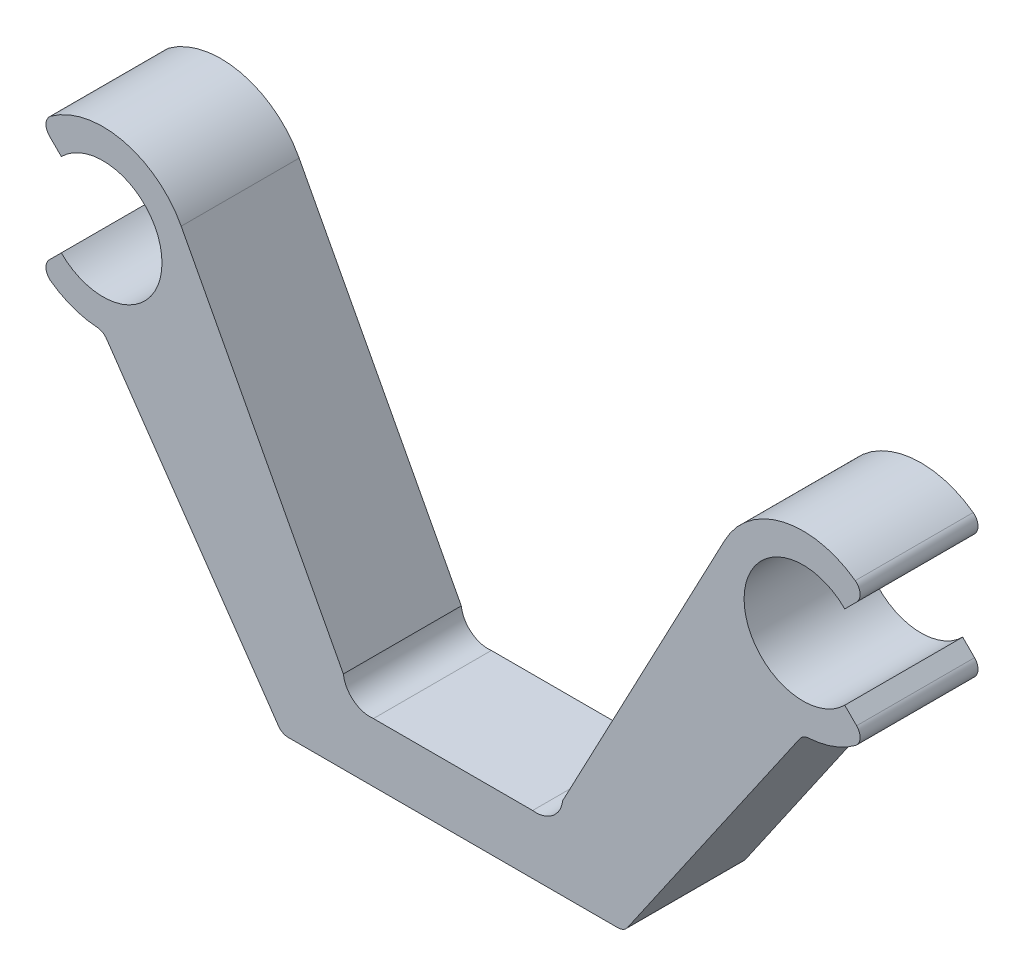
ISO-10303-21;
HEADER;
FILE_DESCRIPTION(('STEP AP214'),'2;1');
FILE_NAME('part.step','',(''),(''),'','','');
FILE_SCHEMA(('AUTOMOTIVE_DESIGN { 1 0 10303 214 1 1 1 1 }'));
ENDSEC;
DATA;
#1=APPLICATION_CONTEXT('core data for automotive mechanical design processes');
#2=APPLICATION_PROTOCOL_DEFINITION('international standard','automotive_design',2000,#1);
#3=PRODUCT_CONTEXT('',#1,'mechanical');
#4=PRODUCT('Part','Part','',(#3));
#5=PRODUCT_RELATED_PRODUCT_CATEGORY('part','',(#4));
#6=PRODUCT_DEFINITION_FORMATION('','',#4);
#7=PRODUCT_DEFINITION_CONTEXT('part definition',#1,'design');
#8=PRODUCT_DEFINITION('design','',#6,#7);
#9=PRODUCT_DEFINITION_SHAPE('','',#8);
#10=(LENGTH_UNIT() NAMED_UNIT(*) SI_UNIT(.MILLI.,.METRE.));
#11=(NAMED_UNIT(*) PLANE_ANGLE_UNIT() SI_UNIT($,.RADIAN.));
#12=(NAMED_UNIT(*) SI_UNIT($,.STERADIAN.) SOLID_ANGLE_UNIT());
#13=UNCERTAINTY_MEASURE_WITH_UNIT(LENGTH_MEASURE(1.E-05),#10,'distance_accuracy_value','');
#14=(GEOMETRIC_REPRESENTATION_CONTEXT(3) GLOBAL_UNCERTAINTY_ASSIGNED_CONTEXT((#13)) GLOBAL_UNIT_ASSIGNED_CONTEXT((#10,
#11,#12)) REPRESENTATION_CONTEXT('',''));
#15=CARTESIAN_POINT('',(0.,0.,0.));
#16=DIRECTION('',(0.,0.,1.));
#17=DIRECTION('',(1.,0.,0.));
#18=AXIS2_PLACEMENT_3D('',#15,#16,#17);
#19=CARTESIAN_POINT('',(-14.5,0.,10.));
#20=DIRECTION('',(0.823080115562498,0.567925279738123,0.));
#21=DIRECTION('',(-0.567925279738123,0.823080115562498,0.));
#22=AXIS2_PLACEMENT_3D('',#19,#20,#21);
#23=PLANE('',#22);
#24=DIRECTION('',(0.567925279738123,-0.823080115562497,0.));
#25=VECTOR('',#24,1.);
#26=CARTESIAN_POINT('',(-14.5,0.,10.));
#27=LINE('',#26,#25);
#28=CARTESIAN_POINT('',(-29.3935692224924,21.5848829311485,10.));
#29=VERTEX_POINT('',#28);
#30=CARTESIAN_POINT('',(-14.7981315569807,0.432074720261878,10.));
#31=VERTEX_POINT('',#30);
#32=EDGE_CURVE('E282',#29,#31,#27,.T.);
#33=ORIENTED_EDGE('',*,*,#32,.F.);
#34=DIRECTION('',(0.,0.,1.));
#35=VECTOR('',#34,1.);
#36=CARTESIAN_POINT('',(-29.3935692224924,21.5848829311485,0.));
#37=LINE('',#36,#35);
#38=CARTESIAN_POINT('',(-29.3935692224924,21.5848829311485,0.));
#39=VERTEX_POINT('',#38);
#40=EDGE_CURVE('E341',#29,#39,#37,.F.);
#41=ORIENTED_EDGE('',*,*,#40,.T.);
#42=DIRECTION('',(0.567925279738123,-0.823080115562497,0.));
#43=VECTOR('',#42,1.);
#44=CARTESIAN_POINT('',(-14.5,0.,0.));
#45=LINE('',#44,#43);
#46=CARTESIAN_POINT('',(-14.7981315569807,0.432074720261878,0.));
#47=VERTEX_POINT('',#46);
#48=EDGE_CURVE('E472',#39,#47,#45,.T.);
#49=ORIENTED_EDGE('',*,*,#48,.T.);
#50=DIRECTION('',(0.,0.,-1.));
#51=VECTOR('',#50,1.);
#52=CARTESIAN_POINT('',(-14.7981315569807,0.432074720261878,10.));
#53=LINE('',#52,#51);
#54=EDGE_CURVE('E338',#47,#31,#53,.F.);
#55=ORIENTED_EDGE('',*,*,#54,.T.);
#56=EDGE_LOOP('',(#33,#41,#49,#55));
#57=FACE_BOUND('',#56,.T.);
#58=ADVANCED_FACE('F38',(#57),#23,.F.);
#59=CARTESIAN_POINT('',(14.5,0.,10.));
#60=DIRECTION('',(0.,1.,0.));
#61=DIRECTION('',(0.,0.,1.));
#62=AXIS2_PLACEMENT_3D('',#59,#60,#61);
#63=PLANE('',#62);
#64=CARTESIAN_POINT('',(-11.75,0.,5.));
#65=DIRECTION('',(0.,-1.,0.));
#66=DIRECTION('',(0.,0.,-1.));
#67=AXIS2_PLACEMENT_3D('',#64,#65,#66);
#68=CIRCLE('',#67,1.35);
#69=CARTESIAN_POINT('',(-11.75,0.,3.65));
#70=VERTEX_POINT('',#69);
#71=EDGE_CURVE('E490',#70,#70,#68,.T.);
#72=ORIENTED_EDGE('',*,*,#71,.F.);
#73=EDGE_LOOP('',(#72));
#74=FACE_BOUND('',#73,.T.);
#75=CARTESIAN_POINT('',(11.75,0.,5.));
#76=DIRECTION('',(0.,-1.,0.));
#77=DIRECTION('',(0.,0.,-1.));
#78=AXIS2_PLACEMENT_3D('',#75,#76,#77);
#79=CIRCLE('',#78,1.35);
#80=CARTESIAN_POINT('',(11.75,0.,3.65));
#81=VERTEX_POINT('',#80);
#82=EDGE_CURVE('E548',#81,#81,#79,.T.);
#83=ORIENTED_EDGE('',*,*,#82,.F.);
#84=EDGE_LOOP('',(#83));
#85=FACE_BOUND('',#84,.T.);
#86=DIRECTION('',(1.,0.,0.));
#87=VECTOR('',#86,1.);
#88=CARTESIAN_POINT('',(14.5,0.,0.));
#89=LINE('',#88,#87);
#90=CARTESIAN_POINT('',(-13.9750514414182,0.,0.));
#91=VERTEX_POINT('',#90);
#92=CARTESIAN_POINT('',(13.9750514414182,0.,0.));
#93=VERTEX_POINT('',#92);
#94=EDGE_CURVE('E420',#91,#93,#89,.T.);
#95=ORIENTED_EDGE('',*,*,#94,.T.);
#96=DIRECTION('',(0.,0.,-1.));
#97=VECTOR('',#96,1.);
#98=CARTESIAN_POINT('',(13.9750514414182,0.,10.));
#99=LINE('',#98,#97);
#100=CARTESIAN_POINT('',(13.9750514414182,0.,10.));
#101=VERTEX_POINT('',#100);
#102=EDGE_CURVE('E398',#93,#101,#99,.F.);
#103=ORIENTED_EDGE('',*,*,#102,.T.);
#104=DIRECTION('',(1.,0.,0.));
#105=VECTOR('',#104,1.);
#106=CARTESIAN_POINT('',(14.5,0.,10.));
#107=LINE('',#106,#105);
#108=CARTESIAN_POINT('',(-13.9750514414182,0.,10.));
#109=VERTEX_POINT('',#108);
#110=EDGE_CURVE('E434',#109,#101,#107,.T.);
#111=ORIENTED_EDGE('',*,*,#110,.F.);
#112=DIRECTION('',(0.,0.,-1.));
#113=VECTOR('',#112,1.);
#114=CARTESIAN_POINT('',(-13.9750514414182,0.,10.));
#115=LINE('',#114,#113);
#116=EDGE_CURVE('E394',#109,#91,#115,.T.);
#117=ORIENTED_EDGE('',*,*,#116,.T.);
#118=EDGE_LOOP('',(#95,#103,#111,#117));
#119=FACE_BOUND('',#118,.T.);
#120=ADVANCED_FACE('F516',(#74,#85,#119),#63,.F.);
#121=CARTESIAN_POINT('',(14.5,0.,10.));
#122=DIRECTION('',(-0.823080115562498,0.567925279738123,0.));
#123=DIRECTION('',(-0.567925279738123,-0.823080115562498,0.));
#124=AXIS2_PLACEMENT_3D('',#121,#122,#123);
#125=PLANE('',#124);
#126=DIRECTION('',(0.567925279738123,0.823080115562497,0.));
#127=VECTOR('',#126,1.);
#128=CARTESIAN_POINT('',(14.5,0.,0.));
#129=LINE('',#128,#127);
#130=CARTESIAN_POINT('',(14.7981315569807,0.432074720261876,0.));
#131=VERTEX_POINT('',#130);
#132=CARTESIAN_POINT('',(29.3935692224924,21.5848829311485,0.));
#133=VERTEX_POINT('',#132);
#134=EDGE_CURVE('E410',#131,#133,#129,.T.);
#135=ORIENTED_EDGE('',*,*,#134,.T.);
#136=DIRECTION('',(0.,0.,1.));
#137=VECTOR('',#136,1.);
#138=CARTESIAN_POINT('',(29.3935692224924,21.5848829311485,10.));
#139=LINE('',#138,#137);
#140=CARTESIAN_POINT('',(29.3935692224924,21.5848829311485,10.));
#141=VERTEX_POINT('',#140);
#142=EDGE_CURVE('E387',#133,#141,#139,.T.);
#143=ORIENTED_EDGE('',*,*,#142,.T.);
#144=DIRECTION('',(0.567925279738123,0.823080115562497,0.));
#145=VECTOR('',#144,1.);
#146=CARTESIAN_POINT('',(14.5,0.,10.));
#147=LINE('',#146,#145);
#148=CARTESIAN_POINT('',(14.7981315569807,0.432074720261876,10.));
#149=VERTEX_POINT('',#148);
#150=EDGE_CURVE('E426',#149,#141,#147,.T.);
#151=ORIENTED_EDGE('',*,*,#150,.F.);
#152=DIRECTION('',(0.,0.,-1.));
#153=VECTOR('',#152,1.);
#154=CARTESIAN_POINT('',(14.7981315569807,0.432074720261876,10.));
#155=LINE('',#154,#153);
#156=EDGE_CURVE('E383',#149,#131,#155,.T.);
#157=ORIENTED_EDGE('',*,*,#156,.T.);
#158=EDGE_LOOP('',(#135,#143,#151,#157));
#159=FACE_BOUND('',#158,.T.);
#160=ADVANCED_FACE('F415',(#159),#125,.F.);
#161=CARTESIAN_POINT('',(29.68,29.5,10.));
#162=DIRECTION('',(0.,0.,-1.));
#163=DIRECTION('',(-1.,0.,0.));
#164=AXIS2_PLACEMENT_3D('',#161,#162,#163);
#165=CYLINDRICAL_SURFACE('',#164,7.5);
#166=CARTESIAN_POINT('',(29.68,29.5,10.));
#167=DIRECTION('',(0.,0.,1.));
#168=DIRECTION('',(-1.,0.,0.));
#169=AXIS2_PLACEMENT_3D('',#166,#167,#168);
#170=CIRCLE('',#169,7.5);
#171=CARTESIAN_POINT('',(30.1535141218132,22.0149626335974,10.));
#172=VERTEX_POINT('',#171);
#173=CARTESIAN_POINT('',(34.1042716345688,23.4439434857698,10.));
#174=VERTEX_POINT('',#173);
#175=EDGE_CURVE('E425',#172,#174,#170,.T.);
#176=ORIENTED_EDGE('',*,*,#175,.F.);
#177=DIRECTION('',(0.,0.,-1.));
#178=VECTOR('',#177,1.);
#179=CARTESIAN_POINT('',(30.1535141218132,22.0149626335974,10.));
#180=LINE('',#179,#178);
#181=CARTESIAN_POINT('',(30.1535141218132,22.0149626335974,0.));
#182=VERTEX_POINT('',#181);
#183=EDGE_CURVE('E379',#172,#182,#180,.T.);
#184=ORIENTED_EDGE('',*,*,#183,.T.);
#185=CARTESIAN_POINT('',(29.68,29.5,0.));
#186=DIRECTION('',(0.,0.,1.));
#187=DIRECTION('',(-1.,0.,0.));
#188=AXIS2_PLACEMENT_3D('',#185,#186,#187);
#189=CIRCLE('',#188,7.5);
#190=CARTESIAN_POINT('',(34.1042716345688,23.4439434857698,0.));
#191=VERTEX_POINT('',#190);
#192=EDGE_CURVE('E249',#182,#191,#189,.T.);
#193=ORIENTED_EDGE('',*,*,#192,.T.);
#194=DIRECTION('',(0.,0.,-1.));
#195=VECTOR('',#194,1.);
#196=CARTESIAN_POINT('',(34.1042716345688,23.4439434857698,10.));
#197=LINE('',#196,#195);
#198=EDGE_CURVE('E62',#191,#174,#197,.F.);
#199=ORIENTED_EDGE('',*,*,#198,.T.);
#200=EDGE_LOOP('',(#176,#184,#193,#199));
#201=FACE_BOUND('',#200,.T.);
#202=ADVANCED_FACE('F427',(#201),#165,.T.);
#203=CARTESIAN_POINT('',(29.68,29.5,10.));
#204=DIRECTION('',(-0.707106781186554,-0.707106781186541,0.));
#205=DIRECTION('',(0.707106781186541,-0.707106781186554,0.));
#206=AXIS2_PLACEMENT_3D('',#203,#204,#205);
#207=PLANE('',#206);
#208=DIRECTION('',(-0.707106781186541,0.707106781186554,0.));
#209=VECTOR('',#208,1.);
#210=CARTESIAN_POINT('',(29.68,29.5,10.));
#211=LINE('',#210,#209);
#212=CARTESIAN_POINT('',(34.2214755311462,24.9585244688537,10.));
#213=VERTEX_POINT('',#212);
#214=CARTESIAN_POINT('',(33.2155339059327,25.9644660940672,10.));
#215=VERTEX_POINT('',#214);
#216=EDGE_CURVE('E429',#213,#215,#211,.T.);
#217=ORIENTED_EDGE('',*,*,#216,.F.);
#218=DIRECTION('',(0.,0.,-1.));
#219=VECTOR('',#218,1.);
#220=CARTESIAN_POINT('',(34.2214755311462,24.9585244688537,10.));
#221=LINE('',#220,#219);
#222=CARTESIAN_POINT('',(34.2214755311462,24.9585244688537,0.));
#223=VERTEX_POINT('',#222);
#224=EDGE_CURVE('E390',#213,#223,#221,.T.);
#225=ORIENTED_EDGE('',*,*,#224,.T.);
#226=DIRECTION('',(-0.707106781186541,0.707106781186554,0.));
#227=VECTOR('',#226,1.);
#228=CARTESIAN_POINT('',(29.68,29.5,0.));
#229=LINE('',#228,#227);
#230=CARTESIAN_POINT('',(33.2155339059327,25.9644660940672,0.));
#231=VERTEX_POINT('',#230);
#232=EDGE_CURVE('E243',#223,#231,#229,.T.);
#233=ORIENTED_EDGE('',*,*,#232,.T.);
#234=DIRECTION('',(0.,0.,1.));
#235=VECTOR('',#234,1.);
#236=CARTESIAN_POINT('',(33.2155339059327,25.9644660940672,0.));
#237=LINE('',#236,#235);
#238=EDGE_CURVE('E220',#231,#215,#237,.T.);
#239=ORIENTED_EDGE('',*,*,#238,.T.);
#240=EDGE_LOOP('',(#217,#225,#233,#239));
#241=FACE_BOUND('',#240,.T.);
#242=ADVANCED_FACE('F484',(#241),#207,.F.);
#243=CARTESIAN_POINT('',(29.68,29.5,10.));
#244=DIRECTION('',(-0.707106781186544,0.707106781186551,0.));
#245=DIRECTION('',(-0.707106781186551,-0.707106781186544,0.));
#246=AXIS2_PLACEMENT_3D('',#243,#244,#245);
#247=PLANE('',#246);
#248=DIRECTION('',(0.707106781186551,0.707106781186544,0.));
#249=VECTOR('',#248,1.);
#250=CARTESIAN_POINT('',(29.68,29.5,0.));
#251=LINE('',#250,#249);
#252=CARTESIAN_POINT('',(33.2155339059328,33.0355339059327,0.));
#253=VERTEX_POINT('',#252);
#254=CARTESIAN_POINT('',(34.2214755311463,34.0414755311462,0.));
#255=VERTEX_POINT('',#254);
#256=EDGE_CURVE('E232',#253,#255,#251,.T.);
#257=ORIENTED_EDGE('',*,*,#256,.T.);
#258=DIRECTION('',(0.,0.,-1.));
#259=VECTOR('',#258,1.);
#260=CARTESIAN_POINT('',(34.2214755311463,34.0414755311462,10.));
#261=LINE('',#260,#259);
#262=CARTESIAN_POINT('',(34.2214755311463,34.0414755311462,10.));
#263=VERTEX_POINT('',#262);
#264=EDGE_CURVE('E363',#255,#263,#261,.F.);
#265=ORIENTED_EDGE('',*,*,#264,.T.);
#266=DIRECTION('',(0.707106781186551,0.707106781186544,0.));
#267=VECTOR('',#266,1.);
#268=CARTESIAN_POINT('',(29.68,29.5,10.));
#269=LINE('',#268,#267);
#270=CARTESIAN_POINT('',(33.2155339059328,33.0355339059327,10.));
#271=VERTEX_POINT('',#270);
#272=EDGE_CURVE('E235',#271,#263,#269,.T.);
#273=ORIENTED_EDGE('',*,*,#272,.F.);
#274=DIRECTION('',(0.,0.,1.));
#275=VECTOR('',#274,1.);
#276=CARTESIAN_POINT('',(33.2155339059328,33.0355339059327,0.));
#277=LINE('',#276,#275);
#278=EDGE_CURVE('E217',#271,#253,#277,.F.);
#279=ORIENTED_EDGE('',*,*,#278,.T.);
#280=EDGE_LOOP('',(#257,#265,#273,#279));
#281=FACE_BOUND('',#280,.T.);
#282=ADVANCED_FACE('F231',(#281),#247,.F.);
#283=CARTESIAN_POINT('',(29.68,29.5,10.));
#284=DIRECTION('',(0.,0.,-1.));
#285=DIRECTION('',(-1.,0.,0.));
#286=AXIS2_PLACEMENT_3D('',#283,#284,#285);
#287=CYLINDRICAL_SURFACE('',#286,7.5);
#288=CARTESIAN_POINT('',(29.68,29.5,10.));
#289=DIRECTION('',(0.,0.,1.));
#290=DIRECTION('',(-1.,0.,0.));
#291=AXIS2_PLACEMENT_3D('',#288,#289,#290);
#292=CIRCLE('',#291,7.5);
#293=CARTESIAN_POINT('',(34.1042716345689,35.5560565142301,10.));
#294=VERTEX_POINT('',#293);
#295=CARTESIAN_POINT('',(23.0497519628966,33.0056826676821,10.));
#296=VERTEX_POINT('',#295);
#297=EDGE_CURVE('E440',#294,#296,#292,.T.);
#298=ORIENTED_EDGE('',*,*,#297,.F.);
#299=DIRECTION('',(0.,0.,-1.));
#300=VECTOR('',#299,1.);
#301=CARTESIAN_POINT('',(34.1042716345689,35.5560565142301,10.));
#302=LINE('',#301,#300);
#303=CARTESIAN_POINT('',(34.1042716345689,35.5560565142301,0.));
#304=VERTEX_POINT('',#303);
#305=EDGE_CURVE('E348',#294,#304,#302,.T.);
#306=ORIENTED_EDGE('',*,*,#305,.T.);
#307=CARTESIAN_POINT('',(29.68,29.5,0.));
#308=DIRECTION('',(0.,0.,1.));
#309=DIRECTION('',(-1.,0.,0.));
#310=AXIS2_PLACEMENT_3D('',#307,#308,#309);
#311=CIRCLE('',#310,7.5);
#312=CARTESIAN_POINT('',(23.0497519628966,33.0056826676821,0.));
#313=VERTEX_POINT('',#312);
#314=EDGE_CURVE('E242',#304,#313,#311,.T.);
#315=ORIENTED_EDGE('',*,*,#314,.T.);
#316=DIRECTION('',(0.,0.,-1.));
#317=VECTOR('',#316,1.);
#318=CARTESIAN_POINT('',(23.0497519628966,33.0056826676821,10.));
#319=LINE('',#318,#317);
#320=EDGE_CURVE('E304',#296,#313,#319,.T.);
#321=ORIENTED_EDGE('',*,*,#320,.F.);
#322=EDGE_LOOP('',(#298,#306,#315,#321));
#323=FACE_BOUND('',#322,.T.);
#324=ADVANCED_FACE('F663',(#323),#287,.T.);
#325=CARTESIAN_POINT('',(9.29948644052819,7.,10.));
#326=DIRECTION('',(0.884033071613786,-0.467424355690945,0.));
#327=DIRECTION('',(0.467424355690945,0.884033071613786,0.));
#328=AXIS2_PLACEMENT_3D('',#325,#326,#327);
#329=PLANE('',#328);
#330=DIRECTION('',(-0.467424355690945,-0.884033071613786,0.));
#331=VECTOR('',#330,1.);
#332=CARTESIAN_POINT('',(9.29948644052819,7.,0.));
#333=LINE('',#332,#331);
#334=CARTESIAN_POINT('',(9.29948644052819,7.,0.));
#335=VERTEX_POINT('',#334);
#336=EDGE_CURVE('E247',#313,#335,#333,.T.);
#337=ORIENTED_EDGE('',*,*,#336,.T.);
#338=DIRECTION('',(0.,0.,-1.));
#339=VECTOR('',#338,1.);
#340=CARTESIAN_POINT('',(9.29948644052819,7.,10.));
#341=LINE('',#340,#339);
#342=CARTESIAN_POINT('',(9.29948644052819,7.,10.));
#343=VERTEX_POINT('',#342);
#344=EDGE_CURVE('E300',#343,#335,#341,.T.);
#345=ORIENTED_EDGE('',*,*,#344,.F.);
#346=DIRECTION('',(-0.467424355690945,-0.884033071613786,0.));
#347=VECTOR('',#346,1.);
#348=CARTESIAN_POINT('',(9.29948644052819,7.,10.));
#349=LINE('',#348,#347);
#350=EDGE_CURVE('E443',#296,#343,#349,.T.);
#351=ORIENTED_EDGE('',*,*,#350,.F.);
#352=ORIENTED_EDGE('',*,*,#320,.T.);
#353=EDGE_LOOP('',(#337,#345,#351,#352));
#354=FACE_BOUND('',#353,.T.);
#355=ADVANCED_FACE('F667',(#354),#329,.F.);
#356=CARTESIAN_POINT('',(7.02474322026409,7.2747432202641,10.));
#357=DIRECTION('',(0.,0.,-1.));
#358=DIRECTION('',(-1.,0.,0.));
#359=AXIS2_PLACEMENT_3D('',#356,#357,#358);
#360=CYLINDRICAL_SURFACE('',#359,2.29127487552641);
#361=CARTESIAN_POINT('',(7.02474322026409,7.2747432202641,0.));
#362=DIRECTION('',(0.,0.,-1.));
#363=DIRECTION('',(1.,0.,0.));
#364=AXIS2_PLACEMENT_3D('',#361,#362,#363);
#365=CIRCLE('',#364,2.29127487552641);
#366=CARTESIAN_POINT('',(6.75,5.,0.));
#367=VERTEX_POINT('',#366);
#368=EDGE_CURVE('E255',#335,#367,#365,.T.);
#369=ORIENTED_EDGE('',*,*,#368,.T.);
#370=DIRECTION('',(0.,0.,-1.));
#371=VECTOR('',#370,1.);
#372=CARTESIAN_POINT('',(6.75,5.,10.));
#373=LINE('',#372,#371);
#374=CARTESIAN_POINT('',(6.75,5.,10.));
#375=VERTEX_POINT('',#374);
#376=EDGE_CURVE('E296',#375,#367,#373,.T.);
#377=ORIENTED_EDGE('',*,*,#376,.F.);
#378=CARTESIAN_POINT('',(7.02474322026409,7.2747432202641,10.));
#379=DIRECTION('',(0.,0.,-1.));
#380=DIRECTION('',(1.,0.,0.));
#381=AXIS2_PLACEMENT_3D('',#378,#379,#380);
#382=CIRCLE('',#381,2.29127487552641);
#383=EDGE_CURVE('E446',#343,#375,#382,.T.);
#384=ORIENTED_EDGE('',*,*,#383,.F.);
#385=ORIENTED_EDGE('',*,*,#344,.T.);
#386=EDGE_LOOP('',(#369,#377,#384,#385));
#387=FACE_BOUND('',#386,.T.);
#388=ADVANCED_FACE('F720',(#387),#360,.F.);
#389=CARTESIAN_POINT('',(6.75,5.,10.));
#390=DIRECTION('',(0.,-1.,0.));
#391=DIRECTION('',(0.,0.,-1.));
#392=AXIS2_PLACEMENT_3D('',#389,#390,#391);
#393=PLANE('',#392);
#394=DIRECTION('',(-1.,0.,0.));
#395=VECTOR('',#394,1.);
#396=CARTESIAN_POINT('',(6.75,5.,0.));
#397=LINE('',#396,#395);
#398=CARTESIAN_POINT('',(-6.75,5.,0.));
#399=VERTEX_POINT('',#398);
#400=EDGE_CURVE('E258',#367,#399,#397,.T.);
#401=ORIENTED_EDGE('',*,*,#400,.T.);
#402=DIRECTION('',(0.,0.,-1.));
#403=VECTOR('',#402,1.);
#404=CARTESIAN_POINT('',(-6.75,5.,10.));
#405=LINE('',#404,#403);
#406=CARTESIAN_POINT('',(-6.75,5.,10.));
#407=VERTEX_POINT('',#406);
#408=EDGE_CURVE('E292',#407,#399,#405,.T.);
#409=ORIENTED_EDGE('',*,*,#408,.F.);
#410=DIRECTION('',(-1.,0.,0.));
#411=VECTOR('',#410,1.);
#412=CARTESIAN_POINT('',(6.75,5.,10.));
#413=LINE('',#412,#411);
#414=EDGE_CURVE('E449',#375,#407,#413,.T.);
#415=ORIENTED_EDGE('',*,*,#414,.F.);
#416=ORIENTED_EDGE('',*,*,#376,.T.);
#417=EDGE_LOOP('',(#401,#409,#415,#416));
#418=FACE_BOUND('',#417,.T.);
#419=ADVANCED_FACE('F729',(#418),#393,.F.);
#420=CARTESIAN_POINT('',(-7.02474322026409,7.2747432202641,10.));
#421=DIRECTION('',(0.,0.,-1.));
#422=DIRECTION('',(-1.,0.,0.));
#423=AXIS2_PLACEMENT_3D('',#420,#421,#422);
#424=CYLINDRICAL_SURFACE('',#423,2.29127487552641);
#425=CARTESIAN_POINT('',(-7.02474322026409,7.2747432202641,0.));
#426=DIRECTION('',(0.,0.,-1.));
#427=DIRECTION('',(-1.,0.,0.));
#428=AXIS2_PLACEMENT_3D('',#425,#426,#427);
#429=CIRCLE('',#428,2.29127487552641);
#430=CARTESIAN_POINT('',(-9.29948644052819,7.,0.));
#431=VERTEX_POINT('',#430);
#432=EDGE_CURVE('E261',#399,#431,#429,.T.);
#433=ORIENTED_EDGE('',*,*,#432,.T.);
#434=DIRECTION('',(0.,0.,-1.));
#435=VECTOR('',#434,1.);
#436=CARTESIAN_POINT('',(-9.29948644052819,7.,10.));
#437=LINE('',#436,#435);
#438=CARTESIAN_POINT('',(-9.29948644052819,7.,10.));
#439=VERTEX_POINT('',#438);
#440=EDGE_CURVE('E287',#439,#431,#437,.T.);
#441=ORIENTED_EDGE('',*,*,#440,.F.);
#442=CARTESIAN_POINT('',(-7.02474322026409,7.2747432202641,10.));
#443=DIRECTION('',(0.,0.,-1.));
#444=DIRECTION('',(-1.,0.,0.));
#445=AXIS2_PLACEMENT_3D('',#442,#443,#444);
#446=CIRCLE('',#445,2.29127487552641);
#447=EDGE_CURVE('E452',#407,#439,#446,.T.);
#448=ORIENTED_EDGE('',*,*,#447,.F.);
#449=ORIENTED_EDGE('',*,*,#408,.T.);
#450=EDGE_LOOP('',(#433,#441,#448,#449));
#451=FACE_BOUND('',#450,.T.);
#452=ADVANCED_FACE('F738',(#451),#424,.F.);
#453=CARTESIAN_POINT('',(-9.29948644052819,7.,10.));
#454=DIRECTION('',(-0.884033071613786,-0.467424355690945,0.));
#455=DIRECTION('',(0.467424355690945,-0.884033071613786,0.));
#456=AXIS2_PLACEMENT_3D('',#453,#454,#455);
#457=PLANE('',#456);
#458=DIRECTION('',(-0.467424355690945,0.884033071613786,0.));
#459=VECTOR('',#458,1.);
#460=CARTESIAN_POINT('',(-9.29948644052819,7.,0.));
#461=LINE('',#460,#459);
#462=CARTESIAN_POINT('',(-23.0497519628966,33.0056826676821,0.));
#463=VERTEX_POINT('',#462);
#464=EDGE_CURVE('E264',#431,#463,#461,.T.);
#465=ORIENTED_EDGE('',*,*,#464,.T.);
#466=DIRECTION('',(0.,0.,-1.));
#467=VECTOR('',#466,1.);
#468=CARTESIAN_POINT('',(-23.0497519628966,33.0056826676821,10.));
#469=LINE('',#468,#467);
#470=CARTESIAN_POINT('',(-23.0497519628966,33.0056826676821,10.));
#471=VERTEX_POINT('',#470);
#472=EDGE_CURVE('E283',#471,#463,#469,.T.);
#473=ORIENTED_EDGE('',*,*,#472,.F.);
#474=DIRECTION('',(-0.467424355690945,0.884033071613786,0.));
#475=VECTOR('',#474,1.);
#476=CARTESIAN_POINT('',(-9.29948644052819,7.,10.));
#477=LINE('',#476,#475);
#478=EDGE_CURVE('E455',#439,#471,#477,.T.);
#479=ORIENTED_EDGE('',*,*,#478,.F.);
#480=ORIENTED_EDGE('',*,*,#440,.T.);
#481=EDGE_LOOP('',(#465,#473,#479,#480));
#482=FACE_BOUND('',#481,.T.);
#483=ADVANCED_FACE('F747',(#482),#457,.F.);
#484=CARTESIAN_POINT('',(-29.68,29.5,10.));
#485=DIRECTION('',(0.,0.,-1.));
#486=DIRECTION('',(-1.,0.,0.));
#487=AXIS2_PLACEMENT_3D('',#484,#485,#486);
#488=CYLINDRICAL_SURFACE('',#487,7.5);
#489=CARTESIAN_POINT('',(-29.68,29.5,0.));
#490=DIRECTION('',(0.,0.,1.));
#491=DIRECTION('',(1.,0.,0.));
#492=AXIS2_PLACEMENT_3D('',#489,#490,#491);
#493=CIRCLE('',#492,7.5);
#494=CARTESIAN_POINT('',(-34.1042716345689,35.5560565142301,0.));
#495=VERTEX_POINT('',#494);
#496=EDGE_CURVE('E267',#463,#495,#493,.T.);
#497=ORIENTED_EDGE('',*,*,#496,.T.);
#498=DIRECTION('',(0.,0.,-1.));
#499=VECTOR('',#498,1.);
#500=CARTESIAN_POINT('',(-34.1042716345689,35.5560565142301,10.));
#501=LINE('',#500,#499);
#502=CARTESIAN_POINT('',(-34.1042716345689,35.5560565142301,10.));
#503=VERTEX_POINT('',#502);
#504=EDGE_CURVE('E335',#495,#503,#501,.F.);
#505=ORIENTED_EDGE('',*,*,#504,.T.);
#506=CARTESIAN_POINT('',(-29.68,29.5,10.));
#507=DIRECTION('',(0.,0.,1.));
#508=DIRECTION('',(1.,0.,0.));
#509=AXIS2_PLACEMENT_3D('',#506,#507,#508);
#510=CIRCLE('',#509,7.5);
#511=EDGE_CURVE('E458',#471,#503,#510,.T.);
#512=ORIENTED_EDGE('',*,*,#511,.F.);
#513=ORIENTED_EDGE('',*,*,#472,.T.);
#514=EDGE_LOOP('',(#497,#505,#512,#513));
#515=FACE_BOUND('',#514,.T.);
#516=ADVANCED_FACE('F756',(#515),#488,.T.);
#517=CARTESIAN_POINT('',(-29.68,29.5,10.));
#518=DIRECTION('',(0.707106781186544,0.707106781186551,0.));
#519=DIRECTION('',(-0.707106781186551,0.707106781186544,0.));
#520=AXIS2_PLACEMENT_3D('',#517,#518,#519);
#521=PLANE('',#520);
#522=DIRECTION('',(0.707106781186551,-0.707106781186544,0.));
#523=VECTOR('',#522,1.);
#524=CARTESIAN_POINT('',(-29.68,29.5,10.));
#525=LINE('',#524,#523);
#526=CARTESIAN_POINT('',(-34.2214755311463,34.0414755311462,10.));
#527=VERTEX_POINT('',#526);
#528=CARTESIAN_POINT('',(-33.2155339059328,33.0355339059327,10.));
#529=VERTEX_POINT('',#528);
#530=EDGE_CURVE('E462',#527,#529,#525,.T.);
#531=ORIENTED_EDGE('',*,*,#530,.F.);
#532=DIRECTION('',(0.,0.,-1.));
#533=VECTOR('',#532,1.);
#534=CARTESIAN_POINT('',(-34.2214755311463,34.0414755311462,10.));
#535=LINE('',#534,#533);
#536=CARTESIAN_POINT('',(-34.2214755311463,34.0414755311462,0.));
#537=VERTEX_POINT('',#536);
#538=EDGE_CURVE('E331',#527,#537,#535,.T.);
#539=ORIENTED_EDGE('',*,*,#538,.T.);
#540=DIRECTION('',(0.707106781186551,-0.707106781186544,0.));
#541=VECTOR('',#540,1.);
#542=CARTESIAN_POINT('',(-29.68,29.5,0.));
#543=LINE('',#542,#541);
#544=CARTESIAN_POINT('',(-33.2155339059328,33.0355339059327,0.));
#545=VERTEX_POINT('',#544);
#546=EDGE_CURVE('E271',#537,#545,#543,.T.);
#547=ORIENTED_EDGE('',*,*,#546,.T.);
#548=DIRECTION('',(0.,0.,1.));
#549=VECTOR('',#548,1.);
#550=CARTESIAN_POINT('',(-33.2155339059328,33.0355339059327,0.));
#551=LINE('',#550,#549);
#552=EDGE_CURVE('E476',#545,#529,#551,.T.);
#553=ORIENTED_EDGE('',*,*,#552,.T.);
#554=EDGE_LOOP('',(#531,#539,#547,#553));
#555=FACE_BOUND('',#554,.T.);
#556=ADVANCED_FACE('F766',(#555),#521,.F.);
#557=CARTESIAN_POINT('',(-29.68,29.5,10.));
#558=DIRECTION('',(0.707106781186554,-0.707106781186541,0.));
#559=DIRECTION('',(0.707106781186541,0.707106781186554,0.));
#560=AXIS2_PLACEMENT_3D('',#557,#558,#559);
#561=PLANE('',#560);
#562=DIRECTION('',(-0.707106781186541,-0.707106781186554,0.));
#563=VECTOR('',#562,1.);
#564=CARTESIAN_POINT('',(-29.68,29.5,0.));
#565=LINE('',#564,#563);
#566=CARTESIAN_POINT('',(-33.2155339059327,25.9644660940672,0.));
#567=VERTEX_POINT('',#566);
#568=CARTESIAN_POINT('',(-34.2214755311462,24.9585244688537,0.));
#569=VERTEX_POINT('',#568);
#570=EDGE_CURVE('E274',#567,#569,#565,.T.);
#571=ORIENTED_EDGE('',*,*,#570,.T.);
#572=DIRECTION('',(0.,0.,-1.));
#573=VECTOR('',#572,1.);
#574=CARTESIAN_POINT('',(-34.2214755311462,24.9585244688537,10.));
#575=LINE('',#574,#573);
#576=CARTESIAN_POINT('',(-34.2214755311462,24.9585244688537,10.));
#577=VERTEX_POINT('',#576);
#578=EDGE_CURVE('E322',#569,#577,#575,.F.);
#579=ORIENTED_EDGE('',*,*,#578,.T.);
#580=DIRECTION('',(-0.707106781186541,-0.707106781186554,0.));
#581=VECTOR('',#580,1.);
#582=CARTESIAN_POINT('',(-29.68,29.5,10.));
#583=LINE('',#582,#581);
#584=CARTESIAN_POINT('',(-33.2155339059327,25.9644660940672,10.));
#585=VERTEX_POINT('',#584);
#586=EDGE_CURVE('E465',#585,#577,#583,.T.);
#587=ORIENTED_EDGE('',*,*,#586,.F.);
#588=DIRECTION('',(0.,0.,1.));
#589=VECTOR('',#588,1.);
#590=CARTESIAN_POINT('',(-33.2155339059327,25.9644660940672,0.));
#591=LINE('',#590,#589);
#592=EDGE_CURVE('E496',#585,#567,#591,.F.);
#593=ORIENTED_EDGE('',*,*,#592,.T.);
#594=EDGE_LOOP('',(#571,#579,#587,#593));
#595=FACE_BOUND('',#594,.T.);
#596=ADVANCED_FACE('F538',(#595),#561,.F.);
#597=CARTESIAN_POINT('',(-29.68,29.5,10.));
#598=DIRECTION('',(0.,0.,-1.));
#599=DIRECTION('',(-1.,0.,0.));
#600=AXIS2_PLACEMENT_3D('',#597,#598,#599);
#601=CYLINDRICAL_SURFACE('',#600,7.5);
#602=CARTESIAN_POINT('',(-29.68,29.5,0.));
#603=DIRECTION('',(0.,0.,1.));
#604=DIRECTION('',(1.,0.,0.));
#605=AXIS2_PLACEMENT_3D('',#602,#603,#604);
#606=CIRCLE('',#605,7.5);
#607=CARTESIAN_POINT('',(-34.1042716345688,23.4439434857698,0.));
#608=VERTEX_POINT('',#607);
#609=CARTESIAN_POINT('',(-30.1535141218132,22.0149626335974,0.));
#610=VERTEX_POINT('',#609);
#611=EDGE_CURVE('E278',#608,#610,#606,.T.);
#612=ORIENTED_EDGE('',*,*,#611,.T.);
#613=DIRECTION('',(0.,0.,-1.));
#614=VECTOR('',#613,1.);
#615=CARTESIAN_POINT('',(-30.1535141218132,22.0149626335974,10.));
#616=LINE('',#615,#614);
#617=CARTESIAN_POINT('',(-30.1535141218132,22.0149626335974,10.));
#618=VERTEX_POINT('',#617);
#619=EDGE_CURVE('E345',#610,#618,#616,.F.);
#620=ORIENTED_EDGE('',*,*,#619,.T.);
#621=CARTESIAN_POINT('',(-29.68,29.5,10.));
#622=DIRECTION('',(0.,0.,1.));
#623=DIRECTION('',(1.,0.,0.));
#624=AXIS2_PLACEMENT_3D('',#621,#622,#623);
#625=CIRCLE('',#624,7.5);
#626=CARTESIAN_POINT('',(-34.1042716345688,23.4439434857698,10.));
#627=VERTEX_POINT('',#626);
#628=EDGE_CURVE('E288',#627,#618,#625,.T.);
#629=ORIENTED_EDGE('',*,*,#628,.F.);
#630=DIRECTION('',(0.,0.,-1.));
#631=VECTOR('',#630,1.);
#632=CARTESIAN_POINT('',(-34.1042716345688,23.4439434857698,10.));
#633=LINE('',#632,#631);
#634=EDGE_CURVE('E312',#627,#608,#633,.T.);
#635=ORIENTED_EDGE('',*,*,#634,.T.);
#636=EDGE_LOOP('',(#612,#620,#629,#635));
#637=FACE_BOUND('',#636,.T.);
#638=ADVANCED_FACE('F529',(#637),#601,.T.);
#639=CARTESIAN_POINT('',(-29.68,29.5,10.));
#640=DIRECTION('',(0.,0.,1.));
#641=DIRECTION('',(1.,0.,0.));
#642=AXIS2_PLACEMENT_3D('',#639,#640,#641);
#643=PLANE('',#642);
#644=ORIENTED_EDGE('',*,*,#272,.T.);
#645=CARTESIAN_POINT('',(33.5143687499597,34.7485823123328,10.));
#646=DIRECTION('',(0.,0.,1.));
#647=DIRECTION('',(1.,0.,0.));
#648=AXIS2_PLACEMENT_3D('',#645,#646,#647);
#649=CIRCLE('',#648,1.);
#650=EDGE_CURVE('E374',#263,#294,#649,.T.);
#651=ORIENTED_EDGE('',*,*,#650,.T.);
#652=ORIENTED_EDGE('',*,*,#297,.T.);
#653=ORIENTED_EDGE('',*,*,#350,.T.);
#654=ORIENTED_EDGE('',*,*,#383,.T.);
#655=ORIENTED_EDGE('',*,*,#414,.T.);
#656=ORIENTED_EDGE('',*,*,#447,.T.);
#657=ORIENTED_EDGE('',*,*,#478,.T.);
#658=ORIENTED_EDGE('',*,*,#511,.T.);
#659=CARTESIAN_POINT('',(-33.5143687499597,34.7485823123328,10.));
#660=DIRECTION('',(0.,0.,1.));
#661=DIRECTION('',(1.,0.,0.));
#662=AXIS2_PLACEMENT_3D('',#659,#660,#661);
#663=CIRCLE('',#662,1.);
#664=EDGE_CURVE('E325',#503,#527,#663,.T.);
#665=ORIENTED_EDGE('',*,*,#664,.T.);
#666=ORIENTED_EDGE('',*,*,#530,.T.);
#667=CARTESIAN_POINT('',(-29.68,29.5,10.));
#668=DIRECTION('',(0.,0.,1.));
#669=DIRECTION('',(1.,0.,0.));
#670=AXIS2_PLACEMENT_3D('',#667,#668,#669);
#671=CIRCLE('',#670,5.);
#672=EDGE_CURVE('E225',#585,#529,#671,.T.);
#673=ORIENTED_EDGE('',*,*,#672,.F.);
#674=ORIENTED_EDGE('',*,*,#586,.T.);
#675=CARTESIAN_POINT('',(-33.5143687499596,24.2514176876672,10.));
#676=DIRECTION('',(0.,0.,1.));
#677=DIRECTION('',(1.,0.,0.));
#678=AXIS2_PLACEMENT_3D('',#675,#676,#677);
#679=CIRCLE('',#678,1.);
#680=EDGE_CURVE('E328',#577,#627,#679,.T.);
#681=ORIENTED_EDGE('',*,*,#680,.T.);
#682=ORIENTED_EDGE('',*,*,#628,.T.);
#683=CARTESIAN_POINT('',(-30.2166493380549,21.0169576514104,10.));
#684=DIRECTION('',(0.,0.,1.));
#685=DIRECTION('',(1.,0.,0.));
#686=AXIS2_PLACEMENT_3D('',#683,#684,#685);
#687=CIRCLE('',#686,1.);
#688=EDGE_CURVE('E404',#618,#29,#687,.F.);
#689=ORIENTED_EDGE('',*,*,#688,.T.);
#690=ORIENTED_EDGE('',*,*,#32,.T.);
#691=CARTESIAN_POINT('',(-13.9750514414182,1.,10.));
#692=DIRECTION('',(0.,0.,1.));
#693=DIRECTION('',(1.,0.,0.));
#694=AXIS2_PLACEMENT_3D('',#691,#692,#693);
#695=CIRCLE('',#694,1.);
#696=EDGE_CURVE('E366',#31,#109,#695,.T.);
#697=ORIENTED_EDGE('',*,*,#696,.T.);
#698=ORIENTED_EDGE('',*,*,#110,.T.);
#699=CARTESIAN_POINT('',(13.9750514414182,1.,10.));
#700=DIRECTION('',(0.,0.,1.));
#701=DIRECTION('',(1.,0.,0.));
#702=AXIS2_PLACEMENT_3D('',#699,#700,#701);
#703=CIRCLE('',#702,1.);
#704=EDGE_CURVE('E369',#101,#149,#703,.T.);
#705=ORIENTED_EDGE('',*,*,#704,.T.);
#706=ORIENTED_EDGE('',*,*,#150,.T.);
#707=CARTESIAN_POINT('',(30.2166493380549,21.0169576514104,10.));
#708=DIRECTION('',(0.,0.,1.));
#709=DIRECTION('',(1.,0.,0.));
#710=AXIS2_PLACEMENT_3D('',#707,#708,#709);
#711=CIRCLE('',#710,1.);
#712=EDGE_CURVE('E11',#141,#172,#711,.F.);
#713=ORIENTED_EDGE('',*,*,#712,.T.);
#714=ORIENTED_EDGE('',*,*,#175,.T.);
#715=CARTESIAN_POINT('',(33.5143687499596,24.2514176876672,10.));
#716=DIRECTION('',(0.,0.,1.));
#717=DIRECTION('',(1.,0.,0.));
#718=AXIS2_PLACEMENT_3D('',#715,#716,#717);
#719=CIRCLE('',#718,1.);
#720=EDGE_CURVE('E54',#174,#213,#719,.T.);
#721=ORIENTED_EDGE('',*,*,#720,.T.);
#722=ORIENTED_EDGE('',*,*,#216,.T.);
#723=CARTESIAN_POINT('',(29.68,29.5,10.));
#724=DIRECTION('',(0.,0.,1.));
#725=DIRECTION('',(1.,0.,0.));
#726=AXIS2_PLACEMENT_3D('',#723,#724,#725);
#727=CIRCLE('',#726,5.);
#728=EDGE_CURVE('E226',#271,#215,#727,.T.);
#729=ORIENTED_EDGE('',*,*,#728,.F.);
#730=EDGE_LOOP('',(#644,#651,#652,#653,#654,#655,#656,#657,#658,#665,#666,#673,#674,#681,#682,
#689,#690,#697,#698,#705,#706,#713,#714,#721,#722,#729));
#731=FACE_BOUND('',#730,.T.);
#732=ADVANCED_FACE('F424',(#731),#643,.T.);
#733=CARTESIAN_POINT('',(-29.68,29.5,0.));
#734=DIRECTION('',(0.,0.,1.));
#735=DIRECTION('',(1.,0.,0.));
#736=AXIS2_PLACEMENT_3D('',#733,#734,#735);
#737=PLANE('',#736);
#738=ORIENTED_EDGE('',*,*,#314,.F.);
#739=CARTESIAN_POINT('',(33.5143687499597,34.7485823123328,0.));
#740=DIRECTION('',(0.,0.,1.));
#741=DIRECTION('',(1.,0.,0.));
#742=AXIS2_PLACEMENT_3D('',#739,#740,#741);
#743=CIRCLE('',#742,1.);
#744=EDGE_CURVE('E240',#304,#255,#743,.F.);
#745=ORIENTED_EDGE('',*,*,#744,.T.);
#746=ORIENTED_EDGE('',*,*,#256,.F.);
#747=CARTESIAN_POINT('',(29.68,29.5,0.));
#748=DIRECTION('',(0.,0.,1.));
#749=DIRECTION('',(1.,0.,0.));
#750=AXIS2_PLACEMENT_3D('',#747,#748,#749);
#751=CIRCLE('',#750,5.);
#752=EDGE_CURVE('E213',#253,#231,#751,.T.);
#753=ORIENTED_EDGE('',*,*,#752,.T.);
#754=ORIENTED_EDGE('',*,*,#232,.F.);
#755=CARTESIAN_POINT('',(33.5143687499596,24.2514176876672,0.));
#756=DIRECTION('',(0.,0.,1.));
#757=DIRECTION('',(1.,0.,0.));
#758=AXIS2_PLACEMENT_3D('',#755,#756,#757);
#759=CIRCLE('',#758,1.);
#760=EDGE_CURVE('E358',#223,#191,#759,.F.);
#761=ORIENTED_EDGE('',*,*,#760,.T.);
#762=ORIENTED_EDGE('',*,*,#192,.F.);
#763=CARTESIAN_POINT('',(30.2166493380549,21.0169576514104,0.));
#764=DIRECTION('',(0.,0.,1.));
#765=DIRECTION('',(1.,0.,0.));
#766=AXIS2_PLACEMENT_3D('',#763,#764,#765);
#767=CIRCLE('',#766,1.);
#768=EDGE_CURVE('E47',#182,#133,#767,.T.);
#769=ORIENTED_EDGE('',*,*,#768,.T.);
#770=ORIENTED_EDGE('',*,*,#134,.F.);
#771=CARTESIAN_POINT('',(13.9750514414182,1.,0.));
#772=DIRECTION('',(0.,0.,1.));
#773=DIRECTION('',(1.,0.,0.));
#774=AXIS2_PLACEMENT_3D('',#771,#772,#773);
#775=CIRCLE('',#774,1.);
#776=EDGE_CURVE('E355',#131,#93,#775,.F.);
#777=ORIENTED_EDGE('',*,*,#776,.T.);
#778=ORIENTED_EDGE('',*,*,#94,.F.);
#779=CARTESIAN_POINT('',(-13.9750514414182,1.,0.));
#780=DIRECTION('',(0.,0.,1.));
#781=DIRECTION('',(1.,0.,0.));
#782=AXIS2_PLACEMENT_3D('',#779,#780,#781);
#783=CIRCLE('',#782,1.);
#784=EDGE_CURVE('E352',#91,#47,#783,.F.);
#785=ORIENTED_EDGE('',*,*,#784,.T.);
#786=ORIENTED_EDGE('',*,*,#48,.F.);
#787=CARTESIAN_POINT('',(-30.2166493380549,21.0169576514104,0.));
#788=DIRECTION('',(0.,0.,1.));
#789=DIRECTION('',(1.,0.,0.));
#790=AXIS2_PLACEMENT_3D('',#787,#788,#789);
#791=CIRCLE('',#790,1.);
#792=EDGE_CURVE('E401',#39,#610,#791,.T.);
#793=ORIENTED_EDGE('',*,*,#792,.T.);
#794=ORIENTED_EDGE('',*,*,#611,.F.);
#795=CARTESIAN_POINT('',(-33.5143687499596,24.2514176876672,0.));
#796=DIRECTION('',(0.,0.,1.));
#797=DIRECTION('',(1.,0.,0.));
#798=AXIS2_PLACEMENT_3D('',#795,#796,#797);
#799=CIRCLE('',#798,1.);
#800=EDGE_CURVE('E319',#608,#569,#799,.F.);
#801=ORIENTED_EDGE('',*,*,#800,.T.);
#802=ORIENTED_EDGE('',*,*,#570,.F.);
#803=CARTESIAN_POINT('',(-29.68,29.5,0.));
#804=DIRECTION('',(0.,0.,1.));
#805=DIRECTION('',(1.,0.,0.));
#806=AXIS2_PLACEMENT_3D('',#803,#804,#805);
#807=CIRCLE('',#806,5.);
#808=EDGE_CURVE('E308',#567,#545,#807,.T.);
#809=ORIENTED_EDGE('',*,*,#808,.T.);
#810=ORIENTED_EDGE('',*,*,#546,.F.);
#811=CARTESIAN_POINT('',(-33.5143687499597,34.7485823123328,0.));
#812=DIRECTION('',(0.,0.,1.));
#813=DIRECTION('',(1.,0.,0.));
#814=AXIS2_PLACEMENT_3D('',#811,#812,#813);
#815=CIRCLE('',#814,1.);
#816=EDGE_CURVE('E316',#537,#495,#815,.F.);
#817=ORIENTED_EDGE('',*,*,#816,.T.);
#818=ORIENTED_EDGE('',*,*,#496,.F.);
#819=ORIENTED_EDGE('',*,*,#464,.F.);
#820=ORIENTED_EDGE('',*,*,#432,.F.);
#821=ORIENTED_EDGE('',*,*,#400,.F.);
#822=ORIENTED_EDGE('',*,*,#368,.F.);
#823=ORIENTED_EDGE('',*,*,#336,.F.);
#824=EDGE_LOOP('',(#738,#745,#746,#753,#754,#761,#762,#769,#770,#777,#778,#785,#786,#793,#794,
#801,#802,#809,#810,#817,#818,#819,#820,#821,#822,#823));
#825=FACE_BOUND('',#824,.T.);
#826=ADVANCED_FACE('F239',(#825),#737,.F.);
#827=CARTESIAN_POINT('',(29.68,29.5,0.));
#828=DIRECTION('',(0.,0.,1.));
#829=DIRECTION('',(1.,0.,0.));
#830=AXIS2_PLACEMENT_3D('',#827,#828,#829);
#831=CYLINDRICAL_SURFACE('',#830,5.);
#832=ORIENTED_EDGE('',*,*,#752,.F.);
#833=ORIENTED_EDGE('',*,*,#278,.F.);
#834=ORIENTED_EDGE('',*,*,#728,.T.);
#835=ORIENTED_EDGE('',*,*,#238,.F.);
#836=EDGE_LOOP('',(#832,#833,#834,#835));
#837=FACE_BOUND('',#836,.T.);
#838=ADVANCED_FACE('F215',(#837),#831,.F.);
#839=CARTESIAN_POINT('',(-29.68,29.5,0.));
#840=DIRECTION('',(0.,0.,1.));
#841=DIRECTION('',(1.,0.,0.));
#842=AXIS2_PLACEMENT_3D('',#839,#840,#841);
#843=CYLINDRICAL_SURFACE('',#842,5.);
#844=ORIENTED_EDGE('',*,*,#808,.F.);
#845=ORIENTED_EDGE('',*,*,#592,.F.);
#846=ORIENTED_EDGE('',*,*,#672,.T.);
#847=ORIENTED_EDGE('',*,*,#552,.F.);
#848=EDGE_LOOP('',(#844,#845,#846,#847));
#849=FACE_BOUND('',#848,.T.);
#850=ADVANCED_FACE('F543',(#849),#843,.F.);
#851=CARTESIAN_POINT('',(11.75,3.,5.));
#852=DIRECTION('',(0.,-1.,0.));
#853=DIRECTION('',(0.,0.,-1.));
#854=AXIS2_PLACEMENT_3D('',#851,#852,#853);
#855=CYLINDRICAL_SURFACE('',#854,1.35);
#856=CARTESIAN_POINT('',(11.75,3.,5.));
#857=DIRECTION('',(0.,-1.,0.));
#858=DIRECTION('',(0.,0.,-1.));
#859=AXIS2_PLACEMENT_3D('',#856,#857,#858);
#860=CIRCLE('',#859,1.35);
#861=CARTESIAN_POINT('',(11.75,3.,3.65));
#862=VERTEX_POINT('',#861);
#863=EDGE_CURVE('E552',#862,#862,#860,.T.);
#864=ORIENTED_EDGE('',*,*,#863,.F.);
#865=EDGE_LOOP('',(#864));
#866=FACE_BOUND('',#865,.T.);
#867=ORIENTED_EDGE('',*,*,#82,.T.);
#868=EDGE_LOOP('',(#867));
#869=FACE_BOUND('',#868,.T.);
#870=ADVANCED_FACE('F567',(#866,#869),#855,.F.);
#871=CARTESIAN_POINT('',(11.75,3.,5.));
#872=DIRECTION('',(0.,-1.,0.));
#873=DIRECTION('',(0.,0.,-1.));
#874=AXIS2_PLACEMENT_3D('',#871,#872,#873);
#875=PLANE('',#874);
#876=ORIENTED_EDGE('',*,*,#863,.T.);
#877=EDGE_LOOP('',(#876));
#878=FACE_BOUND('',#877,.T.);
#879=ADVANCED_FACE('F569',(#878),#875,.T.);
#880=CARTESIAN_POINT('',(-11.75,3.,5.));
#881=DIRECTION('',(0.,-1.,0.));
#882=DIRECTION('',(0.,0.,-1.));
#883=AXIS2_PLACEMENT_3D('',#880,#881,#882);
#884=CYLINDRICAL_SURFACE('',#883,1.35);
#885=CARTESIAN_POINT('',(-11.75,3.,5.));
#886=DIRECTION('',(0.,-1.,0.));
#887=DIRECTION('',(0.,0.,-1.));
#888=AXIS2_PLACEMENT_3D('',#885,#886,#887);
#889=CIRCLE('',#888,1.35);
#890=CARTESIAN_POINT('',(-11.75,3.,3.65));
#891=VERTEX_POINT('',#890);
#892=EDGE_CURVE('E486',#891,#891,#889,.T.);
#893=ORIENTED_EDGE('',*,*,#892,.F.);
#894=EDGE_LOOP('',(#893));
#895=FACE_BOUND('',#894,.T.);
#896=ORIENTED_EDGE('',*,*,#71,.T.);
#897=EDGE_LOOP('',(#896));
#898=FACE_BOUND('',#897,.T.);
#899=ADVANCED_FACE('F560',(#895,#898),#884,.F.);
#900=CARTESIAN_POINT('',(-11.75,3.,5.));
#901=DIRECTION('',(0.,-1.,0.));
#902=DIRECTION('',(0.,0.,-1.));
#903=AXIS2_PLACEMENT_3D('',#900,#901,#902);
#904=PLANE('',#903);
#905=ORIENTED_EDGE('',*,*,#892,.T.);
#906=EDGE_LOOP('',(#905));
#907=FACE_BOUND('',#906,.T.);
#908=ADVANCED_FACE('F590',(#907),#904,.T.);
#909=CARTESIAN_POINT('',(-33.5143687499596,24.2514176876672,10.));
#910=DIRECTION('',(0.,0.,-1.));
#911=DIRECTION('',(-1.,0.,0.));
#912=AXIS2_PLACEMENT_3D('',#909,#910,#911);
#913=CYLINDRICAL_SURFACE('',#912,1.);
#914=ORIENTED_EDGE('',*,*,#680,.F.);
#915=ORIENTED_EDGE('',*,*,#578,.F.);
#916=ORIENTED_EDGE('',*,*,#800,.F.);
#917=ORIENTED_EDGE('',*,*,#634,.F.);
#918=EDGE_LOOP('',(#914,#915,#916,#917));
#919=FACE_BOUND('',#918,.T.);
#920=ADVANCED_FACE('F534',(#919),#913,.T.);
#921=CARTESIAN_POINT('',(-33.5143687499597,34.7485823123328,10.));
#922=DIRECTION('',(0.,0.,-1.));
#923=DIRECTION('',(-1.,0.,0.));
#924=AXIS2_PLACEMENT_3D('',#921,#922,#923);
#925=CYLINDRICAL_SURFACE('',#924,1.);
#926=ORIENTED_EDGE('',*,*,#664,.F.);
#927=ORIENTED_EDGE('',*,*,#504,.F.);
#928=ORIENTED_EDGE('',*,*,#816,.F.);
#929=ORIENTED_EDGE('',*,*,#538,.F.);
#930=EDGE_LOOP('',(#926,#927,#928,#929));
#931=FACE_BOUND('',#930,.T.);
#932=ADVANCED_FACE('F589',(#931),#925,.T.);
#933=CARTESIAN_POINT('',(-30.2166493380549,21.0169576514104,10.));
#934=DIRECTION('',(0.,0.,-1.));
#935=DIRECTION('',(-1.,0.,0.));
#936=AXIS2_PLACEMENT_3D('',#933,#934,#935);
#937=CYLINDRICAL_SURFACE('',#936,1.);
#938=ORIENTED_EDGE('',*,*,#688,.F.);
#939=ORIENTED_EDGE('',*,*,#619,.F.);
#940=ORIENTED_EDGE('',*,*,#792,.F.);
#941=ORIENTED_EDGE('',*,*,#40,.F.);
#942=EDGE_LOOP('',(#938,#939,#940,#941));
#943=FACE_BOUND('',#942,.T.);
#944=ADVANCED_FACE('F525',(#943),#937,.F.);
#945=CARTESIAN_POINT('',(33.5143687499597,34.7485823123328,10.));
#946=DIRECTION('',(0.,0.,-1.));
#947=DIRECTION('',(-1.,0.,0.));
#948=AXIS2_PLACEMENT_3D('',#945,#946,#947);
#949=CYLINDRICAL_SURFACE('',#948,1.);
#950=ORIENTED_EDGE('',*,*,#650,.F.);
#951=ORIENTED_EDGE('',*,*,#264,.F.);
#952=ORIENTED_EDGE('',*,*,#744,.F.);
#953=ORIENTED_EDGE('',*,*,#305,.F.);
#954=EDGE_LOOP('',(#950,#951,#952,#953));
#955=FACE_BOUND('',#954,.T.);
#956=ADVANCED_FACE('F596',(#955),#949,.T.);
#957=CARTESIAN_POINT('',(30.2166493380549,21.0169576514104,10.));
#958=DIRECTION('',(0.,0.,-1.));
#959=DIRECTION('',(-1.,0.,0.));
#960=AXIS2_PLACEMENT_3D('',#957,#958,#959);
#961=CYLINDRICAL_SURFACE('',#960,1.);
#962=ORIENTED_EDGE('',*,*,#712,.F.);
#963=ORIENTED_EDGE('',*,*,#142,.F.);
#964=ORIENTED_EDGE('',*,*,#768,.F.);
#965=ORIENTED_EDGE('',*,*,#183,.F.);
#966=EDGE_LOOP('',(#962,#963,#964,#965));
#967=FACE_BOUND('',#966,.T.);
#968=ADVANCED_FACE('F423',(#967),#961,.F.);
#969=CARTESIAN_POINT('',(33.5143687499596,24.2514176876672,10.));
#970=DIRECTION('',(0.,0.,-1.));
#971=DIRECTION('',(-1.,0.,0.));
#972=AXIS2_PLACEMENT_3D('',#969,#970,#971);
#973=CYLINDRICAL_SURFACE('',#972,1.);
#974=ORIENTED_EDGE('',*,*,#720,.F.);
#975=ORIENTED_EDGE('',*,*,#198,.F.);
#976=ORIENTED_EDGE('',*,*,#760,.F.);
#977=ORIENTED_EDGE('',*,*,#224,.F.);
#978=EDGE_LOOP('',(#974,#975,#976,#977));
#979=FACE_BOUND('',#978,.T.);
#980=ADVANCED_FACE('F481',(#979),#973,.T.);
#981=CARTESIAN_POINT('',(13.9750514414182,1.,10.));
#982=DIRECTION('',(0.,0.,-1.));
#983=DIRECTION('',(-1.,0.,0.));
#984=AXIS2_PLACEMENT_3D('',#981,#982,#983);
#985=CYLINDRICAL_SURFACE('',#984,1.);
#986=ORIENTED_EDGE('',*,*,#704,.F.);
#987=ORIENTED_EDGE('',*,*,#102,.F.);
#988=ORIENTED_EDGE('',*,*,#776,.F.);
#989=ORIENTED_EDGE('',*,*,#156,.F.);
#990=EDGE_LOOP('',(#986,#987,#988,#989));
#991=FACE_BOUND('',#990,.T.);
#992=ADVANCED_FACE('F514',(#991),#985,.T.);
#993=CARTESIAN_POINT('',(-13.9750514414182,1.,10.));
#994=DIRECTION('',(0.,0.,-1.));
#995=DIRECTION('',(-1.,0.,0.));
#996=AXIS2_PLACEMENT_3D('',#993,#994,#995);
#997=CYLINDRICAL_SURFACE('',#996,1.);
#998=ORIENTED_EDGE('',*,*,#696,.F.);
#999=ORIENTED_EDGE('',*,*,#54,.F.);
#1000=ORIENTED_EDGE('',*,*,#784,.F.);
#1001=ORIENTED_EDGE('',*,*,#116,.F.);
#1002=EDGE_LOOP('',(#998,#999,#1000,#1001));
#1003=FACE_BOUND('',#1002,.T.);
#1004=ADVANCED_FACE('F40',(#1003),#997,.T.);
#1005=CLOSED_SHELL('',(#58,#120,#160,#202,#242,#282,#324,#355,#388,#419,#452,#483,#516,#556,
#596,#638,#732,#826,#838,#850,#870,#879,#899,#908,#920,#932,#944,#956,#968,#980,#992,#1004));
#1006=MANIFOLD_SOLID_BREP('B2',#1005);
#1007=ADVANCED_BREP_SHAPE_REPRESENTATION('',(#18,#1006),#14);
#1008=SHAPE_DEFINITION_REPRESENTATION(#9,#1007);
ENDSEC;
END-ISO-10303-21;
